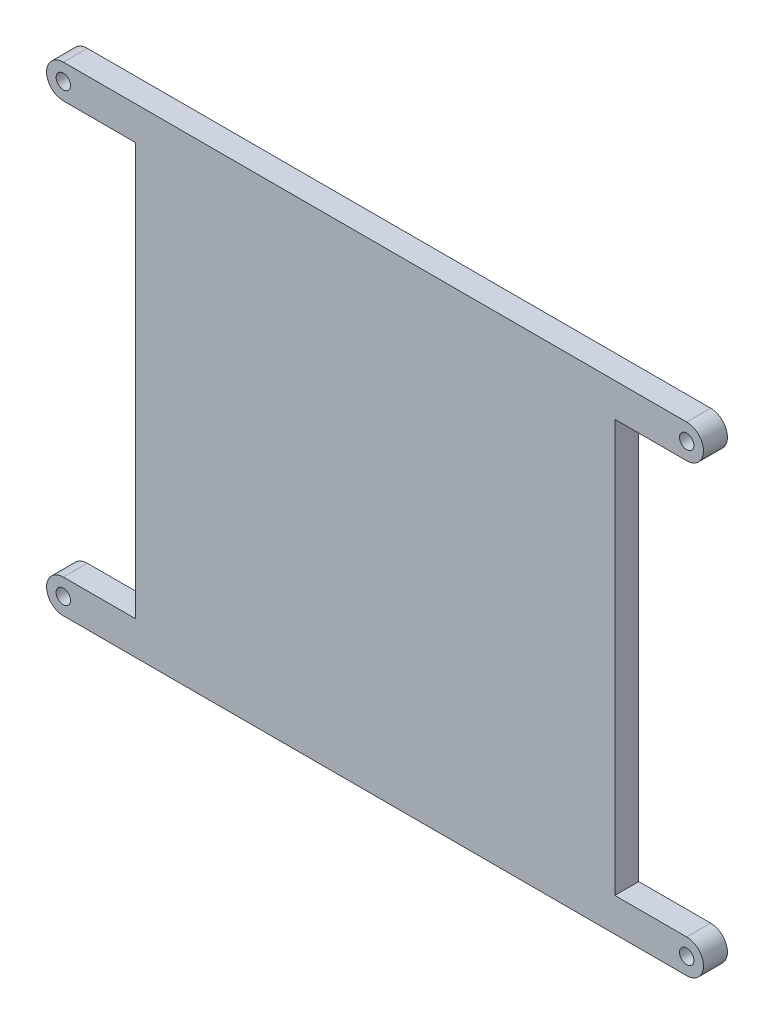
ISO-10303-21;
HEADER;
FILE_DESCRIPTION(('STEP AP214'),'2;1');
FILE_NAME('part.step','',(''),(''),'','','');
FILE_SCHEMA(('AUTOMOTIVE_DESIGN { 1 0 10303 214 1 1 1 1 }'));
ENDSEC;
DATA;
#1=APPLICATION_CONTEXT('core data for automotive mechanical design processes');
#2=APPLICATION_PROTOCOL_DEFINITION('international standard','automotive_design',2000,#1);
#3=PRODUCT_CONTEXT('',#1,'mechanical');
#4=PRODUCT('Part','Part','',(#3));
#5=PRODUCT_RELATED_PRODUCT_CATEGORY('part','',(#4));
#6=PRODUCT_DEFINITION_FORMATION('','',#4);
#7=PRODUCT_DEFINITION_CONTEXT('part definition',#1,'design');
#8=PRODUCT_DEFINITION('design','',#6,#7);
#9=PRODUCT_DEFINITION_SHAPE('','',#8);
#10=(LENGTH_UNIT() NAMED_UNIT(*) SI_UNIT(.MILLI.,.METRE.));
#11=(NAMED_UNIT(*) PLANE_ANGLE_UNIT() SI_UNIT($,.RADIAN.));
#12=(NAMED_UNIT(*) SI_UNIT($,.STERADIAN.) SOLID_ANGLE_UNIT());
#13=UNCERTAINTY_MEASURE_WITH_UNIT(LENGTH_MEASURE(1.E-05),#10,'distance_accuracy_value','');
#14=(GEOMETRIC_REPRESENTATION_CONTEXT(3) GLOBAL_UNCERTAINTY_ASSIGNED_CONTEXT((#13)) GLOBAL_UNIT_ASSIGNED_CONTEXT((#10,
#11,#12)) REPRESENTATION_CONTEXT('',''));
#15=CARTESIAN_POINT('',(0.,0.,0.));
#16=DIRECTION('',(0.,0.,1.));
#17=DIRECTION('',(1.,0.,0.));
#18=AXIS2_PLACEMENT_3D('',#15,#16,#17);
#19=CARTESIAN_POINT('',(0.,-43.,5.));
#20=DIRECTION('',(0.,1.,0.));
#21=DIRECTION('',(0.,0.,1.));
#22=AXIS2_PLACEMENT_3D('',#19,#20,#21);
#23=PLANE('',#22);
#24=DIRECTION('',(1.,0.,0.));
#25=VECTOR('',#24,1.);
#26=CARTESIAN_POINT('',(0.,-43.,0.));
#27=LINE('',#26,#25);
#28=CARTESIAN_POINT('',(-65.,-43.,0.));
#29=VERTEX_POINT('',#28);
#30=CARTESIAN_POINT('',(-50.,-43.,0.));
#31=VERTEX_POINT('',#30);
#32=EDGE_CURVE('E180',#29,#31,#27,.T.);
#33=ORIENTED_EDGE('',*,*,#32,.F.);
#34=DIRECTION('',(0.,0.,-1.));
#35=VECTOR('',#34,1.);
#36=CARTESIAN_POINT('',(-65.,-43.,5.));
#37=LINE('',#36,#35);
#38=CARTESIAN_POINT('',(-65.,-43.,5.));
#39=VERTEX_POINT('',#38);
#40=EDGE_CURVE('E11',#39,#29,#37,.T.);
#41=ORIENTED_EDGE('',*,*,#40,.F.);
#42=DIRECTION('',(1.,0.,0.));
#43=VECTOR('',#42,1.);
#44=CARTESIAN_POINT('',(0.,-43.,5.));
#45=LINE('',#44,#43);
#46=CARTESIAN_POINT('',(-50.,-43.,5.));
#47=VERTEX_POINT('',#46);
#48=EDGE_CURVE('E420',#39,#47,#45,.T.);
#49=ORIENTED_EDGE('',*,*,#48,.T.);
#50=DIRECTION('',(0.,0.,-1.));
#51=VECTOR('',#50,1.);
#52=CARTESIAN_POINT('',(-50.,-43.,5.));
#53=LINE('',#52,#51);
#54=EDGE_CURVE('E50',#47,#31,#53,.T.);
#55=ORIENTED_EDGE('',*,*,#54,.T.);
#56=EDGE_LOOP('',(#33,#41,#49,#55));
#57=FACE_BOUND('',#56,.T.);
#58=ADVANCED_FACE('F33',(#57),#23,.T.);
#59=CARTESIAN_POINT('',(-65.,-46.5,5.));
#60=DIRECTION('',(0.,0.,-1.));
#61=DIRECTION('',(-1.,0.,0.));
#62=AXIS2_PLACEMENT_3D('',#59,#60,#61);
#63=CYLINDRICAL_SURFACE('',#62,3.5);
#64=CARTESIAN_POINT('',(-65.,-46.5,0.));
#65=DIRECTION('',(0.,0.,1.));
#66=DIRECTION('',(1.,0.,0.));
#67=AXIS2_PLACEMENT_3D('',#64,#65,#66);
#68=CIRCLE('',#67,3.5);
#69=CARTESIAN_POINT('',(-65.,-50.,0.));
#70=VERTEX_POINT('',#69);
#71=EDGE_CURVE('E177',#29,#70,#68,.T.);
#72=ORIENTED_EDGE('',*,*,#71,.T.);
#73=DIRECTION('',(0.,0.,-1.));
#74=VECTOR('',#73,1.);
#75=CARTESIAN_POINT('',(-65.,-50.,5.));
#76=LINE('',#75,#74);
#77=CARTESIAN_POINT('',(-65.,-50.,5.));
#78=VERTEX_POINT('',#77);
#79=EDGE_CURVE('E42',#78,#70,#76,.T.);
#80=ORIENTED_EDGE('',*,*,#79,.F.);
#81=CARTESIAN_POINT('',(-65.,-46.5,5.));
#82=DIRECTION('',(0.,0.,1.));
#83=DIRECTION('',(1.,0.,0.));
#84=AXIS2_PLACEMENT_3D('',#81,#82,#83);
#85=CIRCLE('',#84,3.5);
#86=EDGE_CURVE('E418',#39,#78,#85,.T.);
#87=ORIENTED_EDGE('',*,*,#86,.F.);
#88=ORIENTED_EDGE('',*,*,#40,.T.);
#89=EDGE_LOOP('',(#72,#80,#87,#88));
#90=FACE_BOUND('',#89,.T.);
#91=ADVANCED_FACE('F178',(#90),#63,.T.);
#92=CARTESIAN_POINT('',(0.,-50.,5.));
#93=DIRECTION('',(0.,-1.,0.));
#94=DIRECTION('',(1.,0.,0.));
#95=AXIS2_PLACEMENT_3D('',#92,#93,#94);
#96=PLANE('',#95);
#97=DIRECTION('',(-1.,0.,0.));
#98=VECTOR('',#97,1.);
#99=CARTESIAN_POINT('',(0.,-50.,0.));
#100=LINE('',#99,#98);
#101=CARTESIAN_POINT('',(65.,-50.,0.));
#102=VERTEX_POINT('',#101);
#103=EDGE_CURVE('E172',#102,#70,#100,.T.);
#104=ORIENTED_EDGE('',*,*,#103,.F.);
#105=DIRECTION('',(0.,0.,-1.));
#106=VECTOR('',#105,1.);
#107=CARTESIAN_POINT('',(65.,-50.,5.));
#108=LINE('',#107,#106);
#109=CARTESIAN_POINT('',(65.,-50.,5.));
#110=VERTEX_POINT('',#109);
#111=EDGE_CURVE('E164',#110,#102,#108,.T.);
#112=ORIENTED_EDGE('',*,*,#111,.F.);
#113=DIRECTION('',(-1.,0.,0.));
#114=VECTOR('',#113,1.);
#115=CARTESIAN_POINT('',(0.,-50.,5.));
#116=LINE('',#115,#114);
#117=EDGE_CURVE('E174',#110,#78,#116,.T.);
#118=ORIENTED_EDGE('',*,*,#117,.T.);
#119=ORIENTED_EDGE('',*,*,#79,.T.);
#120=EDGE_LOOP('',(#104,#112,#118,#119));
#121=FACE_BOUND('',#120,.T.);
#122=ADVANCED_FACE('F170',(#121),#96,.T.);
#123=CARTESIAN_POINT('',(65.,-46.5,5.));
#124=DIRECTION('',(0.,0.,-1.));
#125=DIRECTION('',(-1.,0.,0.));
#126=AXIS2_PLACEMENT_3D('',#123,#124,#125);
#127=CYLINDRICAL_SURFACE('',#126,3.5);
#128=CARTESIAN_POINT('',(65.,-46.5,0.));
#129=DIRECTION('',(0.,0.,1.));
#130=DIRECTION('',(1.,0.,0.));
#131=AXIS2_PLACEMENT_3D('',#128,#129,#130);
#132=CIRCLE('',#131,3.5);
#133=CARTESIAN_POINT('',(65.,-43.,0.));
#134=VERTEX_POINT('',#133);
#135=EDGE_CURVE('E185',#102,#134,#132,.T.);
#136=ORIENTED_EDGE('',*,*,#135,.T.);
#137=DIRECTION('',(0.,0.,-1.));
#138=VECTOR('',#137,1.);
#139=CARTESIAN_POINT('',(65.,-43.,5.));
#140=LINE('',#139,#138);
#141=CARTESIAN_POINT('',(65.,-43.,5.));
#142=VERTEX_POINT('',#141);
#143=EDGE_CURVE('E161',#142,#134,#140,.T.);
#144=ORIENTED_EDGE('',*,*,#143,.F.);
#145=CARTESIAN_POINT('',(65.,-46.5,5.));
#146=DIRECTION('',(0.,0.,1.));
#147=DIRECTION('',(1.,0.,0.));
#148=AXIS2_PLACEMENT_3D('',#145,#146,#147);
#149=CIRCLE('',#148,3.5);
#150=EDGE_CURVE('E414',#110,#142,#149,.T.);
#151=ORIENTED_EDGE('',*,*,#150,.F.);
#152=ORIENTED_EDGE('',*,*,#111,.T.);
#153=EDGE_LOOP('',(#136,#144,#151,#152));
#154=FACE_BOUND('',#153,.T.);
#155=ADVANCED_FACE('F371',(#154),#127,.T.);
#156=CARTESIAN_POINT('',(0.,-43.,5.));
#157=DIRECTION('',(0.,-1.,0.));
#158=DIRECTION('',(0.,0.,-1.));
#159=AXIS2_PLACEMENT_3D('',#156,#157,#158);
#160=PLANE('',#159);
#161=DIRECTION('',(-1.,0.,0.));
#162=VECTOR('',#161,1.);
#163=CARTESIAN_POINT('',(0.,-43.,0.));
#164=LINE('',#163,#162);
#165=CARTESIAN_POINT('',(50.,-43.,0.));
#166=VERTEX_POINT('',#165);
#167=EDGE_CURVE('E187',#134,#166,#164,.T.);
#168=ORIENTED_EDGE('',*,*,#167,.T.);
#169=DIRECTION('',(0.,0.,-1.));
#170=VECTOR('',#169,1.);
#171=CARTESIAN_POINT('',(50.,-43.,5.));
#172=LINE('',#171,#170);
#173=CARTESIAN_POINT('',(50.,-43.,5.));
#174=VERTEX_POINT('',#173);
#175=EDGE_CURVE('E158',#174,#166,#172,.T.);
#176=ORIENTED_EDGE('',*,*,#175,.F.);
#177=DIRECTION('',(-1.,0.,0.));
#178=VECTOR('',#177,1.);
#179=CARTESIAN_POINT('',(0.,-43.,5.));
#180=LINE('',#179,#178);
#181=EDGE_CURVE('E416',#142,#174,#180,.T.);
#182=ORIENTED_EDGE('',*,*,#181,.F.);
#183=ORIENTED_EDGE('',*,*,#143,.T.);
#184=EDGE_LOOP('',(#168,#176,#182,#183));
#185=FACE_BOUND('',#184,.T.);
#186=ADVANCED_FACE('F361',(#185),#160,.F.);
#187=CARTESIAN_POINT('',(50.,0.,5.));
#188=DIRECTION('',(-1.,0.,0.));
#189=DIRECTION('',(0.,0.,1.));
#190=AXIS2_PLACEMENT_3D('',#187,#188,#189);
#191=PLANE('',#190);
#192=DIRECTION('',(0.,1.,0.));
#193=VECTOR('',#192,1.);
#194=CARTESIAN_POINT('',(50.,0.,0.));
#195=LINE('',#194,#193);
#196=CARTESIAN_POINT('',(50.,43.,0.));
#197=VERTEX_POINT('',#196);
#198=EDGE_CURVE('E193',#166,#197,#195,.T.);
#199=ORIENTED_EDGE('',*,*,#198,.T.);
#200=DIRECTION('',(0.,0.,-1.));
#201=VECTOR('',#200,1.);
#202=CARTESIAN_POINT('',(50.,43.,5.));
#203=LINE('',#202,#201);
#204=CARTESIAN_POINT('',(50.,43.,5.));
#205=VERTEX_POINT('',#204);
#206=EDGE_CURVE('E156',#205,#197,#203,.T.);
#207=ORIENTED_EDGE('',*,*,#206,.F.);
#208=DIRECTION('',(0.,1.,0.));
#209=VECTOR('',#208,1.);
#210=CARTESIAN_POINT('',(50.,0.,5.));
#211=LINE('',#210,#209);
#212=EDGE_CURVE('E425',#174,#205,#211,.T.);
#213=ORIENTED_EDGE('',*,*,#212,.F.);
#214=ORIENTED_EDGE('',*,*,#175,.T.);
#215=EDGE_LOOP('',(#199,#207,#213,#214));
#216=FACE_BOUND('',#215,.T.);
#217=ADVANCED_FACE('F351',(#216),#191,.F.);
#218=CARTESIAN_POINT('',(0.,43.,5.));
#219=DIRECTION('',(0.,-1.,0.));
#220=DIRECTION('',(1.,0.,0.));
#221=AXIS2_PLACEMENT_3D('',#218,#219,#220);
#222=PLANE('',#221);
#223=DIRECTION('',(-1.,0.,0.));
#224=VECTOR('',#223,1.);
#225=CARTESIAN_POINT('',(0.,43.,0.));
#226=LINE('',#225,#224);
#227=CARTESIAN_POINT('',(65.,43.,0.));
#228=VERTEX_POINT('',#227);
#229=EDGE_CURVE('E196',#228,#197,#226,.T.);
#230=ORIENTED_EDGE('',*,*,#229,.F.);
#231=DIRECTION('',(0.,0.,-1.));
#232=VECTOR('',#231,1.);
#233=CARTESIAN_POINT('',(65.,43.,5.));
#234=LINE('',#233,#232);
#235=CARTESIAN_POINT('',(65.,43.,5.));
#236=VERTEX_POINT('',#235);
#237=EDGE_CURVE('E154',#236,#228,#234,.T.);
#238=ORIENTED_EDGE('',*,*,#237,.F.);
#239=DIRECTION('',(-1.,0.,0.));
#240=VECTOR('',#239,1.);
#241=CARTESIAN_POINT('',(0.,43.,5.));
#242=LINE('',#241,#240);
#243=EDGE_CURVE('E427',#236,#205,#242,.T.);
#244=ORIENTED_EDGE('',*,*,#243,.T.);
#245=ORIENTED_EDGE('',*,*,#206,.T.);
#246=EDGE_LOOP('',(#230,#238,#244,#245));
#247=FACE_BOUND('',#246,.T.);
#248=ADVANCED_FACE('F340',(#247),#222,.T.);
#249=CARTESIAN_POINT('',(65.,46.5,5.));
#250=DIRECTION('',(0.,0.,-1.));
#251=DIRECTION('',(-1.,0.,0.));
#252=AXIS2_PLACEMENT_3D('',#249,#250,#251);
#253=CYLINDRICAL_SURFACE('',#252,3.5);
#254=CARTESIAN_POINT('',(65.,46.5,0.));
#255=DIRECTION('',(0.,0.,1.));
#256=DIRECTION('',(1.,0.,0.));
#257=AXIS2_PLACEMENT_3D('',#254,#255,#256);
#258=CIRCLE('',#257,3.5);
#259=CARTESIAN_POINT('',(65.,50.,0.));
#260=VERTEX_POINT('',#259);
#261=EDGE_CURVE('E199',#228,#260,#258,.T.);
#262=ORIENTED_EDGE('',*,*,#261,.T.);
#263=DIRECTION('',(0.,0.,-1.));
#264=VECTOR('',#263,1.);
#265=CARTESIAN_POINT('',(65.,50.,5.));
#266=LINE('',#265,#264);
#267=CARTESIAN_POINT('',(65.,50.,5.));
#268=VERTEX_POINT('',#267);
#269=EDGE_CURVE('E148',#268,#260,#266,.T.);
#270=ORIENTED_EDGE('',*,*,#269,.F.);
#271=CARTESIAN_POINT('',(65.,46.5,5.));
#272=DIRECTION('',(0.,0.,1.));
#273=DIRECTION('',(1.,0.,0.));
#274=AXIS2_PLACEMENT_3D('',#271,#272,#273);
#275=CIRCLE('',#274,3.5);
#276=EDGE_CURVE('E430',#236,#268,#275,.T.);
#277=ORIENTED_EDGE('',*,*,#276,.F.);
#278=ORIENTED_EDGE('',*,*,#237,.T.);
#279=EDGE_LOOP('',(#262,#270,#277,#278));
#280=FACE_BOUND('',#279,.T.);
#281=ADVANCED_FACE('F329',(#280),#253,.T.);
#282=CARTESIAN_POINT('',(0.,50.,5.));
#283=DIRECTION('',(0.,1.,0.));
#284=DIRECTION('',(0.,0.,1.));
#285=AXIS2_PLACEMENT_3D('',#282,#283,#284);
#286=PLANE('',#285);
#287=DIRECTION('',(1.,0.,0.));
#288=VECTOR('',#287,1.);
#289=CARTESIAN_POINT('',(0.,50.,0.));
#290=LINE('',#289,#288);
#291=CARTESIAN_POINT('',(-65.,50.,0.));
#292=VERTEX_POINT('',#291);
#293=EDGE_CURVE('E202',#292,#260,#290,.T.);
#294=ORIENTED_EDGE('',*,*,#293,.F.);
#295=DIRECTION('',(0.,0.,-1.));
#296=VECTOR('',#295,1.);
#297=CARTESIAN_POINT('',(-65.,50.,5.));
#298=LINE('',#297,#296);
#299=CARTESIAN_POINT('',(-65.,50.,5.));
#300=VERTEX_POINT('',#299);
#301=EDGE_CURVE('E146',#300,#292,#298,.T.);
#302=ORIENTED_EDGE('',*,*,#301,.F.);
#303=DIRECTION('',(1.,0.,0.));
#304=VECTOR('',#303,1.);
#305=CARTESIAN_POINT('',(0.,50.,5.));
#306=LINE('',#305,#304);
#307=EDGE_CURVE('E140',#300,#268,#306,.T.);
#308=ORIENTED_EDGE('',*,*,#307,.T.);
#309=ORIENTED_EDGE('',*,*,#269,.T.);
#310=EDGE_LOOP('',(#294,#302,#308,#309));
#311=FACE_BOUND('',#310,.T.);
#312=ADVANCED_FACE('F320',(#311),#286,.T.);
#313=CARTESIAN_POINT('',(-65.,46.5,5.));
#314=DIRECTION('',(0.,0.,-1.));
#315=DIRECTION('',(-1.,0.,0.));
#316=AXIS2_PLACEMENT_3D('',#313,#314,#315);
#317=CYLINDRICAL_SURFACE('',#316,3.5);
#318=CARTESIAN_POINT('',(-65.,46.5,0.));
#319=DIRECTION('',(0.,0.,1.));
#320=DIRECTION('',(1.,0.,0.));
#321=AXIS2_PLACEMENT_3D('',#318,#319,#320);
#322=CIRCLE('',#321,3.5);
#323=CARTESIAN_POINT('',(-65.,43.,0.));
#324=VERTEX_POINT('',#323);
#325=EDGE_CURVE('E145',#292,#324,#322,.T.);
#326=ORIENTED_EDGE('',*,*,#325,.T.);
#327=DIRECTION('',(0.,0.,-1.));
#328=VECTOR('',#327,1.);
#329=CARTESIAN_POINT('',(-65.,43.,5.));
#330=LINE('',#329,#328);
#331=CARTESIAN_POINT('',(-65.,43.,5.));
#332=VERTEX_POINT('',#331);
#333=EDGE_CURVE('E128',#332,#324,#330,.T.);
#334=ORIENTED_EDGE('',*,*,#333,.F.);
#335=CARTESIAN_POINT('',(-65.,46.5,5.));
#336=DIRECTION('',(0.,0.,1.));
#337=DIRECTION('',(1.,0.,0.));
#338=AXIS2_PLACEMENT_3D('',#335,#336,#337);
#339=CIRCLE('',#338,3.5);
#340=EDGE_CURVE('E133',#300,#332,#339,.T.);
#341=ORIENTED_EDGE('',*,*,#340,.F.);
#342=ORIENTED_EDGE('',*,*,#301,.T.);
#343=EDGE_LOOP('',(#326,#334,#341,#342));
#344=FACE_BOUND('',#343,.T.);
#345=ADVANCED_FACE('F143',(#344),#317,.T.);
#346=CARTESIAN_POINT('',(0.,43.,5.));
#347=DIRECTION('',(0.,1.,0.));
#348=DIRECTION('',(0.,0.,1.));
#349=AXIS2_PLACEMENT_3D('',#346,#347,#348);
#350=PLANE('',#349);
#351=DIRECTION('',(1.,0.,0.));
#352=VECTOR('',#351,1.);
#353=CARTESIAN_POINT('',(0.,43.,0.));
#354=LINE('',#353,#352);
#355=CARTESIAN_POINT('',(-50.,43.,0.));
#356=VERTEX_POINT('',#355);
#357=EDGE_CURVE('E206',#324,#356,#354,.T.);
#358=ORIENTED_EDGE('',*,*,#357,.T.);
#359=DIRECTION('',(0.,0.,-1.));
#360=VECTOR('',#359,1.);
#361=CARTESIAN_POINT('',(-50.,43.,5.));
#362=LINE('',#361,#360);
#363=CARTESIAN_POINT('',(-50.,43.,5.));
#364=VERTEX_POINT('',#363);
#365=EDGE_CURVE('E88',#364,#356,#362,.T.);
#366=ORIENTED_EDGE('',*,*,#365,.F.);
#367=DIRECTION('',(1.,0.,0.));
#368=VECTOR('',#367,1.);
#369=CARTESIAN_POINT('',(0.,43.,5.));
#370=LINE('',#369,#368);
#371=EDGE_CURVE('E124',#332,#364,#370,.T.);
#372=ORIENTED_EDGE('',*,*,#371,.F.);
#373=ORIENTED_EDGE('',*,*,#333,.T.);
#374=EDGE_LOOP('',(#358,#366,#372,#373));
#375=FACE_BOUND('',#374,.T.);
#376=ADVANCED_FACE('F126',(#375),#350,.F.);
#377=CARTESIAN_POINT('',(-65.,-46.5,5.));
#378=DIRECTION('',(0.,0.,-1.));
#379=DIRECTION('',(-1.,0.,0.));
#380=AXIS2_PLACEMENT_3D('',#377,#378,#379);
#381=CYLINDRICAL_SURFACE('',#380,1.5);
#382=CARTESIAN_POINT('',(-65.,-46.5,5.));
#383=DIRECTION('',(0.,0.,1.));
#384=DIRECTION('',(1.,0.,0.));
#385=AXIS2_PLACEMENT_3D('',#382,#383,#384);
#386=CIRCLE('',#385,1.5);
#387=CARTESIAN_POINT('',(-63.5,-46.5,5.));
#388=VERTEX_POINT('',#387);
#389=EDGE_CURVE('E441',#388,#388,#386,.T.);
#390=ORIENTED_EDGE('',*,*,#389,.T.);
#391=EDGE_LOOP('',(#390));
#392=FACE_BOUND('',#391,.T.);
#393=CARTESIAN_POINT('',(-65.,-46.5,0.));
#394=DIRECTION('',(0.,0.,1.));
#395=DIRECTION('',(1.,0.,0.));
#396=AXIS2_PLACEMENT_3D('',#393,#394,#395);
#397=CIRCLE('',#396,1.5);
#398=CARTESIAN_POINT('',(-63.5,-46.5,0.));
#399=VERTEX_POINT('',#398);
#400=EDGE_CURVE('E222',#399,#399,#397,.T.);
#401=ORIENTED_EDGE('',*,*,#400,.F.);
#402=EDGE_LOOP('',(#401));
#403=FACE_BOUND('',#402,.T.);
#404=ADVANCED_FACE('F245',(#392,#403),#381,.F.);
#405=CARTESIAN_POINT('',(65.,-46.5,5.));
#406=DIRECTION('',(0.,0.,-1.));
#407=DIRECTION('',(-1.,0.,0.));
#408=AXIS2_PLACEMENT_3D('',#405,#406,#407);
#409=CYLINDRICAL_SURFACE('',#408,1.5);
#410=CARTESIAN_POINT('',(65.,-46.5,5.));
#411=DIRECTION('',(0.,0.,1.));
#412=DIRECTION('',(1.,0.,0.));
#413=AXIS2_PLACEMENT_3D('',#410,#411,#412);
#414=CIRCLE('',#413,1.5);
#415=CARTESIAN_POINT('',(66.5,-46.5,5.));
#416=VERTEX_POINT('',#415);
#417=EDGE_CURVE('E444',#416,#416,#414,.T.);
#418=ORIENTED_EDGE('',*,*,#417,.T.);
#419=EDGE_LOOP('',(#418));
#420=FACE_BOUND('',#419,.T.);
#421=CARTESIAN_POINT('',(65.,-46.5,0.));
#422=DIRECTION('',(0.,0.,1.));
#423=DIRECTION('',(1.,0.,0.));
#424=AXIS2_PLACEMENT_3D('',#421,#422,#423);
#425=CIRCLE('',#424,1.5);
#426=CARTESIAN_POINT('',(66.5,-46.5,0.));
#427=VERTEX_POINT('',#426);
#428=EDGE_CURVE('E219',#427,#427,#425,.T.);
#429=ORIENTED_EDGE('',*,*,#428,.F.);
#430=EDGE_LOOP('',(#429));
#431=FACE_BOUND('',#430,.T.);
#432=ADVANCED_FACE('F248',(#420,#431),#409,.F.);
#433=CARTESIAN_POINT('',(65.,46.5,5.));
#434=DIRECTION('',(0.,0.,-1.));
#435=DIRECTION('',(-1.,0.,0.));
#436=AXIS2_PLACEMENT_3D('',#433,#434,#435);
#437=CYLINDRICAL_SURFACE('',#436,1.5);
#438=CARTESIAN_POINT('',(65.,46.5,5.));
#439=DIRECTION('',(0.,0.,1.));
#440=DIRECTION('',(1.,0.,0.));
#441=AXIS2_PLACEMENT_3D('',#438,#439,#440);
#442=CIRCLE('',#441,1.5);
#443=CARTESIAN_POINT('',(66.5,46.5,5.));
#444=VERTEX_POINT('',#443);
#445=EDGE_CURVE('E259',#444,#444,#442,.T.);
#446=ORIENTED_EDGE('',*,*,#445,.T.);
#447=EDGE_LOOP('',(#446));
#448=FACE_BOUND('',#447,.T.);
#449=CARTESIAN_POINT('',(65.,46.5,0.));
#450=DIRECTION('',(0.,0.,1.));
#451=DIRECTION('',(1.,0.,0.));
#452=AXIS2_PLACEMENT_3D('',#449,#450,#451);
#453=CIRCLE('',#452,1.5);
#454=CARTESIAN_POINT('',(66.5,46.5,0.));
#455=VERTEX_POINT('',#454);
#456=EDGE_CURVE('E216',#455,#455,#453,.T.);
#457=ORIENTED_EDGE('',*,*,#456,.F.);
#458=EDGE_LOOP('',(#457));
#459=FACE_BOUND('',#458,.T.);
#460=ADVANCED_FACE('F233',(#448,#459),#437,.F.);
#461=CARTESIAN_POINT('',(-65.,46.5,5.));
#462=DIRECTION('',(0.,0.,-1.));
#463=DIRECTION('',(-1.,0.,0.));
#464=AXIS2_PLACEMENT_3D('',#461,#462,#463);
#465=CYLINDRICAL_SURFACE('',#464,1.5);
#466=CARTESIAN_POINT('',(-65.,46.5,5.));
#467=DIRECTION('',(0.,0.,1.));
#468=DIRECTION('',(1.,0.,0.));
#469=AXIS2_PLACEMENT_3D('',#466,#467,#468);
#470=CIRCLE('',#469,1.5);
#471=CARTESIAN_POINT('',(-63.5,46.5,5.));
#472=VERTEX_POINT('',#471);
#473=EDGE_CURVE('E210',#472,#472,#470,.T.);
#474=ORIENTED_EDGE('',*,*,#473,.T.);
#475=EDGE_LOOP('',(#474));
#476=FACE_BOUND('',#475,.T.);
#477=CARTESIAN_POINT('',(-65.,46.5,0.));
#478=DIRECTION('',(0.,0.,1.));
#479=DIRECTION('',(1.,0.,0.));
#480=AXIS2_PLACEMENT_3D('',#477,#478,#479);
#481=CIRCLE('',#480,1.5);
#482=CARTESIAN_POINT('',(-63.5,46.5,0.));
#483=VERTEX_POINT('',#482);
#484=EDGE_CURVE('E213',#483,#483,#481,.T.);
#485=ORIENTED_EDGE('',*,*,#484,.F.);
#486=EDGE_LOOP('',(#485));
#487=FACE_BOUND('',#486,.T.);
#488=ADVANCED_FACE('F35',(#476,#487),#465,.F.);
#489=CARTESIAN_POINT('',(-50.,0.,5.));
#490=DIRECTION('',(-1.,0.,0.));
#491=DIRECTION('',(0.,0.,1.));
#492=AXIS2_PLACEMENT_3D('',#489,#490,#491);
#493=PLANE('',#492);
#494=DIRECTION('',(0.,1.,0.));
#495=VECTOR('',#494,1.);
#496=CARTESIAN_POINT('',(-50.,0.,0.));
#497=LINE('',#496,#495);
#498=EDGE_CURVE('E208',#31,#356,#497,.T.);
#499=ORIENTED_EDGE('',*,*,#498,.F.);
#500=ORIENTED_EDGE('',*,*,#54,.F.);
#501=DIRECTION('',(0.,1.,0.));
#502=VECTOR('',#501,1.);
#503=CARTESIAN_POINT('',(-50.,0.,5.));
#504=LINE('',#503,#502);
#505=EDGE_CURVE('E132',#47,#364,#504,.T.);
#506=ORIENTED_EDGE('',*,*,#505,.T.);
#507=ORIENTED_EDGE('',*,*,#365,.T.);
#508=EDGE_LOOP('',(#499,#500,#506,#507));
#509=FACE_BOUND('',#508,.T.);
#510=ADVANCED_FACE('F224',(#509),#493,.T.);
#511=CARTESIAN_POINT('',(0.,0.,5.));
#512=DIRECTION('',(0.,0.,1.));
#513=DIRECTION('',(1.,0.,0.));
#514=AXIS2_PLACEMENT_3D('',#511,#512,#513);
#515=PLANE('',#514);
#516=ORIENTED_EDGE('',*,*,#473,.F.);
#517=EDGE_LOOP('',(#516));
#518=FACE_BOUND('',#517,.T.);
#519=ORIENTED_EDGE('',*,*,#445,.F.);
#520=EDGE_LOOP('',(#519));
#521=FACE_BOUND('',#520,.T.);
#522=ORIENTED_EDGE('',*,*,#417,.F.);
#523=EDGE_LOOP('',(#522));
#524=FACE_BOUND('',#523,.T.);
#525=ORIENTED_EDGE('',*,*,#389,.F.);
#526=EDGE_LOOP('',(#525));
#527=FACE_BOUND('',#526,.T.);
#528=ORIENTED_EDGE('',*,*,#48,.F.);
#529=ORIENTED_EDGE('',*,*,#86,.T.);
#530=ORIENTED_EDGE('',*,*,#117,.F.);
#531=ORIENTED_EDGE('',*,*,#150,.T.);
#532=ORIENTED_EDGE('',*,*,#181,.T.);
#533=ORIENTED_EDGE('',*,*,#212,.T.);
#534=ORIENTED_EDGE('',*,*,#243,.F.);
#535=ORIENTED_EDGE('',*,*,#276,.T.);
#536=ORIENTED_EDGE('',*,*,#307,.F.);
#537=ORIENTED_EDGE('',*,*,#340,.T.);
#538=ORIENTED_EDGE('',*,*,#371,.T.);
#539=ORIENTED_EDGE('',*,*,#505,.F.);
#540=EDGE_LOOP('',(#528,#529,#530,#531,#532,#533,#534,#535,#536,#537,#538,#539));
#541=FACE_BOUND('',#540,.T.);
#542=ADVANCED_FACE('F138',(#518,#521,#524,#527,#541),#515,.T.);
#543=CARTESIAN_POINT('',(0.,0.,0.));
#544=DIRECTION('',(0.,0.,1.));
#545=DIRECTION('',(1.,0.,0.));
#546=AXIS2_PLACEMENT_3D('',#543,#544,#545);
#547=PLANE('',#546);
#548=ORIENTED_EDGE('',*,*,#484,.T.);
#549=EDGE_LOOP('',(#548));
#550=FACE_BOUND('',#549,.T.);
#551=ORIENTED_EDGE('',*,*,#456,.T.);
#552=EDGE_LOOP('',(#551));
#553=FACE_BOUND('',#552,.T.);
#554=ORIENTED_EDGE('',*,*,#428,.T.);
#555=EDGE_LOOP('',(#554));
#556=FACE_BOUND('',#555,.T.);
#557=ORIENTED_EDGE('',*,*,#400,.T.);
#558=EDGE_LOOP('',(#557));
#559=FACE_BOUND('',#558,.T.);
#560=ORIENTED_EDGE('',*,*,#32,.T.);
#561=ORIENTED_EDGE('',*,*,#498,.T.);
#562=ORIENTED_EDGE('',*,*,#357,.F.);
#563=ORIENTED_EDGE('',*,*,#325,.F.);
#564=ORIENTED_EDGE('',*,*,#293,.T.);
#565=ORIENTED_EDGE('',*,*,#261,.F.);
#566=ORIENTED_EDGE('',*,*,#229,.T.);
#567=ORIENTED_EDGE('',*,*,#198,.F.);
#568=ORIENTED_EDGE('',*,*,#167,.F.);
#569=ORIENTED_EDGE('',*,*,#135,.F.);
#570=ORIENTED_EDGE('',*,*,#103,.T.);
#571=ORIENTED_EDGE('',*,*,#71,.F.);
#572=EDGE_LOOP('',(#560,#561,#562,#563,#564,#565,#566,#567,#568,#569,#570,#571));
#573=FACE_BOUND('',#572,.T.);
#574=ADVANCED_FACE('F183',(#550,#553,#556,#559,#573),#547,.F.);
#575=CLOSED_SHELL('',(#58,#91,#122,#155,#186,#217,#248,#281,#312,#345,#376,#404,#432,#460,#488,
#510,#542,#574));
#576=MANIFOLD_SOLID_BREP('B2',#575);
#577=ADVANCED_BREP_SHAPE_REPRESENTATION('',(#18,#576),#14);
#578=SHAPE_DEFINITION_REPRESENTATION(#9,#577);
ENDSEC;
END-ISO-10303-21;
